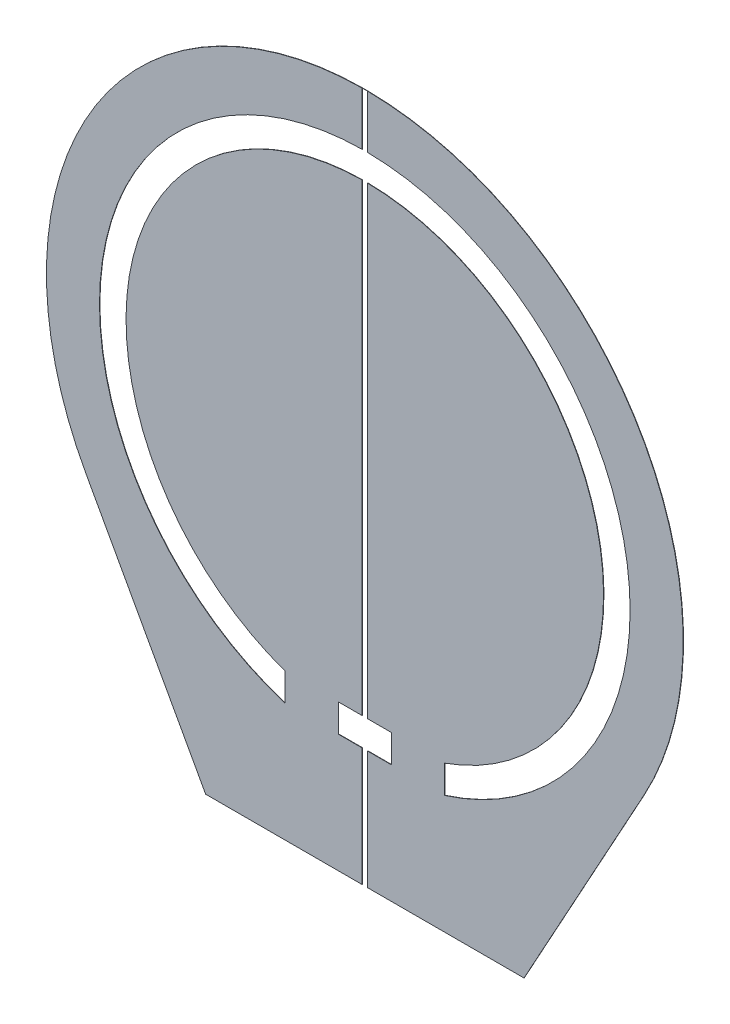
ISO-10303-21;
HEADER;
FILE_DESCRIPTION(('STEP AP214'),'2;1');
FILE_NAME('part.step','',(''),(''),'','','');
FILE_SCHEMA(('AUTOMOTIVE_DESIGN { 1 0 10303 214 1 1 1 1 }'));
ENDSEC;
DATA;
#1=APPLICATION_CONTEXT('core data for automotive mechanical design processes');
#2=APPLICATION_PROTOCOL_DEFINITION('international standard','automotive_design',2000,#1);
#3=PRODUCT_CONTEXT('',#1,'mechanical');
#4=PRODUCT('Part','Part','',(#3));
#5=PRODUCT_RELATED_PRODUCT_CATEGORY('part','',(#4));
#6=PRODUCT_DEFINITION_FORMATION('','',#4);
#7=PRODUCT_DEFINITION_CONTEXT('part definition',#1,'design');
#8=PRODUCT_DEFINITION('design','',#6,#7);
#9=PRODUCT_DEFINITION_SHAPE('','',#8);
#10=(LENGTH_UNIT() NAMED_UNIT(*) SI_UNIT(.MILLI.,.METRE.));
#11=(NAMED_UNIT(*) PLANE_ANGLE_UNIT() SI_UNIT($,.RADIAN.));
#12=(NAMED_UNIT(*) SI_UNIT($,.STERADIAN.) SOLID_ANGLE_UNIT());
#13=UNCERTAINTY_MEASURE_WITH_UNIT(LENGTH_MEASURE(1.E-05),#10,'distance_accuracy_value','');
#14=(GEOMETRIC_REPRESENTATION_CONTEXT(3) GLOBAL_UNCERTAINTY_ASSIGNED_CONTEXT((#13)) GLOBAL_UNIT_ASSIGNED_CONTEXT((#10,
#11,#12)) REPRESENTATION_CONTEXT('',''));
#15=CARTESIAN_POINT('',(0.,0.,0.));
#16=DIRECTION('',(0.,0.,1.));
#17=DIRECTION('',(1.,0.,0.));
#18=AXIS2_PLACEMENT_3D('',#15,#16,#17);
#19=CARTESIAN_POINT('',(0.,0.,0.03556));
#20=DIRECTION('',(0.,0.,-1.));
#21=DIRECTION('',(-1.,0.,0.));
#22=AXIS2_PLACEMENT_3D('',#19,#20,#21);
#23=CYLINDRICAL_SURFACE('',#22,30.);
#24=CARTESIAN_POINT('',(0.,0.,0.03556));
#25=DIRECTION('',(0.,0.,1.));
#26=DIRECTION('',(1.,0.,0.));
#27=AXIS2_PLACEMENT_3D('',#24,#25,#26);
#28=CIRCLE('',#27,30.);
#29=CARTESIAN_POINT('',(-0.25,29.9989583152482,0.03556));
#30=VERTEX_POINT('',#29);
#31=CARTESIAN_POINT('',(-26.2928846581436,-14.4459065604605,0.03556));
#32=VERTEX_POINT('',#31);
#33=EDGE_CURVE('E171',#30,#32,#28,.T.);
#34=ORIENTED_EDGE('',*,*,#33,.F.);
#35=DIRECTION('',(0.,0.,1.));
#36=VECTOR('',#35,1.);
#37=CARTESIAN_POINT('',(-0.25,29.9989583152482,-0.96444));
#38=LINE('',#37,#36);
#39=CARTESIAN_POINT('',(-0.25,29.9989583152482,0.));
#40=VERTEX_POINT('',#39);
#41=EDGE_CURVE('E12',#40,#30,#38,.T.);
#42=ORIENTED_EDGE('',*,*,#41,.F.);
#43=CARTESIAN_POINT('',(0.,0.,0.));
#44=DIRECTION('',(0.,0.,1.));
#45=DIRECTION('',(1.,0.,0.));
#46=AXIS2_PLACEMENT_3D('',#43,#44,#45);
#47=CIRCLE('',#46,30.);
#48=CARTESIAN_POINT('',(-26.2928846581436,-14.4459065604605,0.));
#49=VERTEX_POINT('',#48);
#50=EDGE_CURVE('E184',#40,#49,#47,.T.);
#51=ORIENTED_EDGE('',*,*,#50,.T.);
#52=DIRECTION('',(0.,0.,-1.));
#53=VECTOR('',#52,1.);
#54=CARTESIAN_POINT('',(-26.2928846581436,-14.4459065604605,0.03556));
#55=LINE('',#54,#53);
#56=EDGE_CURVE('E180',#32,#49,#55,.T.);
#57=ORIENTED_EDGE('',*,*,#56,.F.);
#58=EDGE_LOOP('',(#34,#42,#51,#57));
#59=FACE_BOUND('',#58,.T.);
#60=ADVANCED_FACE('F53',(#59),#23,.T.);
#61=CARTESIAN_POINT('',(0.,0.,0.03556));
#62=DIRECTION('',(0.,0.,-1.));
#63=DIRECTION('',(-1.,0.,0.));
#64=AXIS2_PLACEMENT_3D('',#61,#62,#63);
#65=CYLINDRICAL_SURFACE('',#64,25.);
#66=CARTESIAN_POINT('',(0.,0.,0.));
#67=DIRECTION('',(0.,0.,1.));
#68=DIRECTION('',(1.,0.,0.));
#69=AXIS2_PLACEMENT_3D('',#66,#67,#68);
#70=CIRCLE('',#69,25.);
#71=CARTESIAN_POINT('',(-0.25,24.9987499687484,0.));
#72=VERTEX_POINT('',#71);
#73=CARTESIAN_POINT('',(-7.5,-23.8484800354236,0.));
#74=VERTEX_POINT('',#73);
#75=EDGE_CURVE('E56',#72,#74,#70,.T.);
#76=ORIENTED_EDGE('',*,*,#75,.F.);
#77=DIRECTION('',(0.,0.,-1.));
#78=VECTOR('',#77,1.);
#79=CARTESIAN_POINT('',(-0.25,24.9987499687484,0.03556));
#80=LINE('',#79,#78);
#81=CARTESIAN_POINT('',(-0.25,24.9987499687484,0.03556));
#82=VERTEX_POINT('',#81);
#83=EDGE_CURVE('E71',#72,#82,#80,.F.);
#84=ORIENTED_EDGE('',*,*,#83,.T.);
#85=CARTESIAN_POINT('',(0.,0.,0.03556));
#86=DIRECTION('',(0.,0.,1.));
#87=DIRECTION('',(1.,0.,0.));
#88=AXIS2_PLACEMENT_3D('',#85,#86,#87);
#89=CIRCLE('',#88,25.);
#90=CARTESIAN_POINT('',(-7.5,-23.8484800354236,0.03556));
#91=VERTEX_POINT('',#90);
#92=EDGE_CURVE('E181',#82,#91,#89,.T.);
#93=ORIENTED_EDGE('',*,*,#92,.T.);
#94=DIRECTION('',(0.,0.,-1.));
#95=VECTOR('',#94,1.);
#96=CARTESIAN_POINT('',(-7.5,-23.8484800354236,0.03556));
#97=LINE('',#96,#95);
#98=EDGE_CURVE('E183',#91,#74,#97,.T.);
#99=ORIENTED_EDGE('',*,*,#98,.T.);
#100=EDGE_LOOP('',(#76,#84,#93,#99));
#101=FACE_BOUND('',#100,.T.);
#102=ADVANCED_FACE('F244',(#101),#65,.F.);
#103=CARTESIAN_POINT('',(0.,0.,0.03556));
#104=DIRECTION('',(0.,0.,1.));
#105=DIRECTION('',(1.,0.,0.));
#106=AXIS2_PLACEMENT_3D('',#103,#104,#105);
#107=PLANE('',#106);
#108=ORIENTED_EDGE('',*,*,#92,.F.);
#109=DIRECTION('',(0.,1.,0.));
#110=VECTOR('',#109,1.);
#111=CARTESIAN_POINT('',(-0.25,22.4986110682415,0.03556));
#112=LINE('',#111,#110);
#113=EDGE_CURVE('E174',#82,#30,#112,.T.);
#114=ORIENTED_EDGE('',*,*,#113,.T.);
#115=ORIENTED_EDGE('',*,*,#33,.T.);
#116=DIRECTION('',(-0.481530218682018,0.876429488604787,0.));
#117=VECTOR('',#116,1.);
#118=CARTESIAN_POINT('',(-26.2928846581436,-14.4459065604605,0.03556));
#119=LINE('',#118,#117);
#120=CARTESIAN_POINT('',(-15.,-35.0000000354236,0.03556));
#121=VERTEX_POINT('',#120);
#122=EDGE_CURVE('E166',#121,#32,#119,.T.);
#123=ORIENTED_EDGE('',*,*,#122,.F.);
#124=DIRECTION('',(-1.,0.,0.));
#125=VECTOR('',#124,1.);
#126=CARTESIAN_POINT('',(0.,-35.0000000354236,0.03556));
#127=LINE('',#126,#125);
#128=CARTESIAN_POINT('',(-0.25,-35.0000000354236,0.03556));
#129=VERTEX_POINT('',#128);
#130=EDGE_CURVE('E148',#129,#121,#127,.T.);
#131=ORIENTED_EDGE('',*,*,#130,.F.);
#132=DIRECTION('',(0.,-1.,0.));
#133=VECTOR('',#132,1.);
#134=CARTESIAN_POINT('',(-0.25,-21.2132034355964,0.03556));
#135=LINE('',#134,#133);
#136=CARTESIAN_POINT('',(-0.25,-23.8484800355964,0.03556));
#137=VERTEX_POINT('',#136);
#138=EDGE_CURVE('E139',#137,#129,#135,.T.);
#139=ORIENTED_EDGE('',*,*,#138,.F.);
#140=DIRECTION('',(1.,0.,0.));
#141=VECTOR('',#140,1.);
#142=CARTESIAN_POINT('',(0.,-23.8484800355964,0.03556));
#143=LINE('',#142,#141);
#144=CARTESIAN_POINT('',(-2.5,-23.8484800355964,0.03556));
#145=VERTEX_POINT('',#144);
#146=EDGE_CURVE('E176',#145,#137,#143,.T.);
#147=ORIENTED_EDGE('',*,*,#146,.F.);
#148=DIRECTION('',(0.,-1.,0.));
#149=VECTOR('',#148,1.);
#150=CARTESIAN_POINT('',(-2.50000000000001,0.,0.03556));
#151=LINE('',#150,#149);
#152=CARTESIAN_POINT('',(-2.5,-21.2132034355964,0.03556));
#153=VERTEX_POINT('',#152);
#154=EDGE_CURVE('E179',#153,#145,#151,.T.);
#155=ORIENTED_EDGE('',*,*,#154,.F.);
#156=DIRECTION('',(1.,0.,0.));
#157=VECTOR('',#156,1.);
#158=CARTESIAN_POINT('',(0.,-21.2132034355964,0.03556));
#159=LINE('',#158,#157);
#160=CARTESIAN_POINT('',(-0.25,-21.2132034355964,0.03556));
#161=VERTEX_POINT('',#160);
#162=EDGE_CURVE('E173',#153,#161,#159,.T.);
#163=ORIENTED_EDGE('',*,*,#162,.T.);
#164=DIRECTION('',(0.,1.,0.));
#165=VECTOR('',#164,1.);
#166=CARTESIAN_POINT('',(-0.25,0.,0.03556));
#167=LINE('',#166,#165);
#168=CARTESIAN_POINT('',(-0.25,22.4986110682415,0.03556));
#169=VERTEX_POINT('',#168);
#170=EDGE_CURVE('E195',#161,#169,#167,.T.);
#171=ORIENTED_EDGE('',*,*,#170,.T.);
#172=CARTESIAN_POINT('',(0.,0.,0.03556));
#173=DIRECTION('',(0.,0.,1.));
#174=DIRECTION('',(1.,0.,0.));
#175=AXIS2_PLACEMENT_3D('',#172,#173,#174);
#176=CIRCLE('',#175,22.5);
#177=CARTESIAN_POINT('',(-7.5,-21.2132034355964,0.03556));
#178=VERTEX_POINT('',#177);
#179=EDGE_CURVE('E197',#169,#178,#176,.T.);
#180=ORIENTED_EDGE('',*,*,#179,.T.);
#181=DIRECTION('',(0.,-1.,0.));
#182=VECTOR('',#181,1.);
#183=CARTESIAN_POINT('',(-7.49999999999999,0.,0.03556));
#184=LINE('',#183,#182);
#185=EDGE_CURVE('E199',#178,#91,#184,.T.);
#186=ORIENTED_EDGE('',*,*,#185,.T.);
#187=EDGE_LOOP('',(#108,#114,#115,#123,#131,#139,#147,#155,#163,#171,#180,#186));
#188=FACE_BOUND('',#187,.T.);
#189=ADVANCED_FACE('F242',(#188),#107,.T.);
#190=CARTESIAN_POINT('',(0.,0.,0.));
#191=DIRECTION('',(0.,0.,1.));
#192=DIRECTION('',(1.,0.,0.));
#193=AXIS2_PLACEMENT_3D('',#190,#191,#192);
#194=PLANE('',#193);
#195=DIRECTION('',(0.,1.,0.));
#196=VECTOR('',#195,1.);
#197=CARTESIAN_POINT('',(-0.25,0.,0.));
#198=LINE('',#197,#196);
#199=EDGE_CURVE('E62',#72,#40,#198,.T.);
#200=ORIENTED_EDGE('',*,*,#199,.F.);
#201=ORIENTED_EDGE('',*,*,#75,.T.);
#202=DIRECTION('',(0.,-1.,0.));
#203=VECTOR('',#202,1.);
#204=CARTESIAN_POINT('',(-7.49999999999999,0.,0.));
#205=LINE('',#204,#203);
#206=CARTESIAN_POINT('',(-7.5,-21.2132034355964,0.));
#207=VERTEX_POINT('',#206);
#208=EDGE_CURVE('E214',#207,#74,#205,.T.);
#209=ORIENTED_EDGE('',*,*,#208,.F.);
#210=CARTESIAN_POINT('',(0.,0.,0.));
#211=DIRECTION('',(0.,0.,1.));
#212=DIRECTION('',(1.,0.,0.));
#213=AXIS2_PLACEMENT_3D('',#210,#211,#212);
#214=CIRCLE('',#213,22.5);
#215=CARTESIAN_POINT('',(-0.25,22.4986110682415,0.));
#216=VERTEX_POINT('',#215);
#217=EDGE_CURVE('E211',#216,#207,#214,.T.);
#218=ORIENTED_EDGE('',*,*,#217,.F.);
#219=DIRECTION('',(0.,1.,0.));
#220=VECTOR('',#219,1.);
#221=CARTESIAN_POINT('',(-0.25,0.,0.));
#222=LINE('',#221,#220);
#223=CARTESIAN_POINT('',(-0.25,-21.2132034355964,0.));
#224=VERTEX_POINT('',#223);
#225=EDGE_CURVE('E208',#224,#216,#222,.T.);
#226=ORIENTED_EDGE('',*,*,#225,.F.);
#227=DIRECTION('',(1.,0.,0.));
#228=VECTOR('',#227,1.);
#229=CARTESIAN_POINT('',(0.,-21.2132034355964,0.));
#230=LINE('',#229,#228);
#231=CARTESIAN_POINT('',(-2.5,-21.2132034355964,0.));
#232=VERTEX_POINT('',#231);
#233=EDGE_CURVE('E205',#232,#224,#230,.T.);
#234=ORIENTED_EDGE('',*,*,#233,.F.);
#235=DIRECTION('',(0.,-1.,0.));
#236=VECTOR('',#235,1.);
#237=CARTESIAN_POINT('',(-2.50000000000001,0.,0.));
#238=LINE('',#237,#236);
#239=CARTESIAN_POINT('',(-2.5,-23.8484800355964,0.));
#240=VERTEX_POINT('',#239);
#241=EDGE_CURVE('E170',#232,#240,#238,.T.);
#242=ORIENTED_EDGE('',*,*,#241,.T.);
#243=DIRECTION('',(1.,0.,0.));
#244=VECTOR('',#243,1.);
#245=CARTESIAN_POINT('',(0.,-23.8484800355964,0.));
#246=LINE('',#245,#244);
#247=CARTESIAN_POINT('',(-0.25,-23.8484800355964,0.));
#248=VERTEX_POINT('',#247);
#249=EDGE_CURVE('E159',#240,#248,#246,.T.);
#250=ORIENTED_EDGE('',*,*,#249,.T.);
#251=DIRECTION('',(0.,-1.,0.));
#252=VECTOR('',#251,1.);
#253=CARTESIAN_POINT('',(-0.249999999999999,0.,0.));
#254=LINE('',#253,#252);
#255=CARTESIAN_POINT('',(-0.25,-35.0000000354236,0.));
#256=VERTEX_POINT('',#255);
#257=EDGE_CURVE('E144',#248,#256,#254,.T.);
#258=ORIENTED_EDGE('',*,*,#257,.T.);
#259=DIRECTION('',(-1.,0.,0.));
#260=VECTOR('',#259,1.);
#261=CARTESIAN_POINT('',(0.,-35.0000000354236,0.));
#262=LINE('',#261,#260);
#263=CARTESIAN_POINT('',(-15.,-35.0000000354236,0.));
#264=VERTEX_POINT('',#263);
#265=EDGE_CURVE('E155',#256,#264,#262,.T.);
#266=ORIENTED_EDGE('',*,*,#265,.T.);
#267=DIRECTION('',(-0.481530218682018,0.876429488604787,0.));
#268=VECTOR('',#267,1.);
#269=CARTESIAN_POINT('',(-26.2928846581436,-14.4459065604605,0.));
#270=LINE('',#269,#268);
#271=EDGE_CURVE('E165',#264,#49,#270,.T.);
#272=ORIENTED_EDGE('',*,*,#271,.T.);
#273=ORIENTED_EDGE('',*,*,#50,.F.);
#274=EDGE_LOOP('',(#200,#201,#209,#218,#226,#234,#242,#250,#258,#266,#272,#273));
#275=FACE_BOUND('',#274,.T.);
#276=ADVANCED_FACE('F153',(#275),#194,.F.);
#277=CARTESIAN_POINT('',(-26.2928846581436,-14.4459065604605,0.03556));
#278=DIRECTION('',(-0.876429488604787,-0.481530218682018,0.));
#279=DIRECTION('',(0.481530218682018,-0.876429488604787,0.));
#280=AXIS2_PLACEMENT_3D('',#277,#278,#279);
#281=PLANE('',#280);
#282=ORIENTED_EDGE('',*,*,#271,.F.);
#283=DIRECTION('',(0.,0.,-1.));
#284=VECTOR('',#283,1.);
#285=CARTESIAN_POINT('',(-15.,-35.0000000354236,0.03556));
#286=LINE('',#285,#284);
#287=EDGE_CURVE('E163',#121,#264,#286,.T.);
#288=ORIENTED_EDGE('',*,*,#287,.F.);
#289=ORIENTED_EDGE('',*,*,#122,.T.);
#290=ORIENTED_EDGE('',*,*,#56,.T.);
#291=EDGE_LOOP('',(#282,#288,#289,#290));
#292=FACE_BOUND('',#291,.T.);
#293=ADVANCED_FACE('F238',(#292),#281,.T.);
#294=CARTESIAN_POINT('',(0.,-23.8484800355964,0.03556));
#295=DIRECTION('',(0.,1.,0.));
#296=DIRECTION('',(0.,0.,1.));
#297=AXIS2_PLACEMENT_3D('',#294,#295,#296);
#298=PLANE('',#297);
#299=DIRECTION('',(0.,0.,1.));
#300=VECTOR('',#299,1.);
#301=CARTESIAN_POINT('',(-0.25,-23.8484800355964,0.03556));
#302=LINE('',#301,#300);
#303=EDGE_CURVE('E136',#248,#137,#302,.T.);
#304=ORIENTED_EDGE('',*,*,#303,.F.);
#305=ORIENTED_EDGE('',*,*,#249,.F.);
#306=DIRECTION('',(0.,0.,-1.));
#307=VECTOR('',#306,1.);
#308=CARTESIAN_POINT('',(-2.5,-23.8484800355964,0.03556));
#309=LINE('',#308,#307);
#310=EDGE_CURVE('E193',#145,#240,#309,.T.);
#311=ORIENTED_EDGE('',*,*,#310,.F.);
#312=ORIENTED_EDGE('',*,*,#146,.T.);
#313=EDGE_LOOP('',(#304,#305,#311,#312));
#314=FACE_BOUND('',#313,.T.);
#315=ADVANCED_FACE('F270',(#314),#298,.T.);
#316=CARTESIAN_POINT('',(-2.50000000000001,0.,0.03556));
#317=DIRECTION('',(1.,0.,0.));
#318=DIRECTION('',(0.,1.,0.));
#319=AXIS2_PLACEMENT_3D('',#316,#317,#318);
#320=PLANE('',#319);
#321=ORIENTED_EDGE('',*,*,#241,.F.);
#322=DIRECTION('',(0.,0.,-1.));
#323=VECTOR('',#322,1.);
#324=CARTESIAN_POINT('',(-2.5,-21.2132034355964,0.03556));
#325=LINE('',#324,#323);
#326=EDGE_CURVE('E207',#153,#232,#325,.T.);
#327=ORIENTED_EDGE('',*,*,#326,.F.);
#328=ORIENTED_EDGE('',*,*,#154,.T.);
#329=ORIENTED_EDGE('',*,*,#310,.T.);
#330=EDGE_LOOP('',(#321,#327,#328,#329));
#331=FACE_BOUND('',#330,.T.);
#332=ADVANCED_FACE('F265',(#331),#320,.T.);
#333=CARTESIAN_POINT('',(0.,-21.2132034355964,0.03556));
#334=DIRECTION('',(0.,1.,0.));
#335=DIRECTION('',(-1.,0.,0.));
#336=AXIS2_PLACEMENT_3D('',#333,#334,#335);
#337=PLANE('',#336);
#338=ORIENTED_EDGE('',*,*,#233,.T.);
#339=DIRECTION('',(0.,0.,-1.));
#340=VECTOR('',#339,1.);
#341=CARTESIAN_POINT('',(-0.25,-21.2132034355964,0.03556));
#342=LINE('',#341,#340);
#343=EDGE_CURVE('E210',#161,#224,#342,.T.);
#344=ORIENTED_EDGE('',*,*,#343,.F.);
#345=ORIENTED_EDGE('',*,*,#162,.F.);
#346=ORIENTED_EDGE('',*,*,#326,.T.);
#347=EDGE_LOOP('',(#338,#344,#345,#346));
#348=FACE_BOUND('',#347,.T.);
#349=ADVANCED_FACE('F271',(#348),#337,.F.);
#350=CARTESIAN_POINT('',(-0.25,0.,0.03556));
#351=DIRECTION('',(-1.,0.,0.));
#352=DIRECTION('',(0.,0.,1.));
#353=AXIS2_PLACEMENT_3D('',#350,#351,#352);
#354=PLANE('',#353);
#355=ORIENTED_EDGE('',*,*,#225,.T.);
#356=DIRECTION('',(0.,0.,-1.));
#357=VECTOR('',#356,1.);
#358=CARTESIAN_POINT('',(-0.25,22.4986110682415,0.03556));
#359=LINE('',#358,#357);
#360=EDGE_CURVE('E213',#169,#216,#359,.T.);
#361=ORIENTED_EDGE('',*,*,#360,.F.);
#362=ORIENTED_EDGE('',*,*,#170,.F.);
#363=ORIENTED_EDGE('',*,*,#343,.T.);
#364=EDGE_LOOP('',(#355,#361,#362,#363));
#365=FACE_BOUND('',#364,.T.);
#366=ADVANCED_FACE('F259',(#365),#354,.F.);
#367=CARTESIAN_POINT('',(0.,0.,0.03556));
#368=DIRECTION('',(0.,0.,-1.));
#369=DIRECTION('',(-1.,0.,0.));
#370=AXIS2_PLACEMENT_3D('',#367,#368,#369);
#371=CYLINDRICAL_SURFACE('',#370,22.5);
#372=ORIENTED_EDGE('',*,*,#217,.T.);
#373=DIRECTION('',(0.,0.,-1.));
#374=VECTOR('',#373,1.);
#375=CARTESIAN_POINT('',(-7.5,-21.2132034355964,0.03556));
#376=LINE('',#375,#374);
#377=EDGE_CURVE('E149',#178,#207,#376,.T.);
#378=ORIENTED_EDGE('',*,*,#377,.F.);
#379=ORIENTED_EDGE('',*,*,#179,.F.);
#380=ORIENTED_EDGE('',*,*,#360,.T.);
#381=EDGE_LOOP('',(#372,#378,#379,#380));
#382=FACE_BOUND('',#381,.T.);
#383=ADVANCED_FACE('F255',(#382),#371,.T.);
#384=CARTESIAN_POINT('',(-7.49999999999999,0.,0.03556));
#385=DIRECTION('',(1.,0.,0.));
#386=DIRECTION('',(0.,1.,0.));
#387=AXIS2_PLACEMENT_3D('',#384,#385,#386);
#388=PLANE('',#387);
#389=ORIENTED_EDGE('',*,*,#208,.T.);
#390=ORIENTED_EDGE('',*,*,#98,.F.);
#391=ORIENTED_EDGE('',*,*,#185,.F.);
#392=ORIENTED_EDGE('',*,*,#377,.T.);
#393=EDGE_LOOP('',(#389,#390,#391,#392));
#394=FACE_BOUND('',#393,.T.);
#395=ADVANCED_FACE('F250',(#394),#388,.F.);
#396=CARTESIAN_POINT('',(0.,-35.0000000354236,0.03556));
#397=DIRECTION('',(0.,-1.,0.));
#398=DIRECTION('',(1.,0.,0.));
#399=AXIS2_PLACEMENT_3D('',#396,#397,#398);
#400=PLANE('',#399);
#401=DIRECTION('',(0.,0.,1.));
#402=VECTOR('',#401,1.);
#403=CARTESIAN_POINT('',(-0.25,-35.0000000354236,-0.96444));
#404=LINE('',#403,#402);
#405=EDGE_CURVE('E141',#256,#129,#404,.T.);
#406=ORIENTED_EDGE('',*,*,#405,.T.);
#407=ORIENTED_EDGE('',*,*,#130,.T.);
#408=ORIENTED_EDGE('',*,*,#287,.T.);
#409=ORIENTED_EDGE('',*,*,#265,.F.);
#410=EDGE_LOOP('',(#406,#407,#408,#409));
#411=FACE_BOUND('',#410,.T.);
#412=ADVANCED_FACE('F161',(#411),#400,.T.);
#413=CARTESIAN_POINT('',(-0.25,-21.2132034355964,-0.96444));
#414=DIRECTION('',(-1.,0.,0.));
#415=DIRECTION('',(0.,-1.,0.));
#416=AXIS2_PLACEMENT_3D('',#413,#414,#415);
#417=PLANE('',#416);
#418=ORIENTED_EDGE('',*,*,#303,.T.);
#419=ORIENTED_EDGE('',*,*,#138,.T.);
#420=ORIENTED_EDGE('',*,*,#405,.F.);
#421=ORIENTED_EDGE('',*,*,#257,.F.);
#422=EDGE_LOOP('',(#418,#419,#420,#421));
#423=FACE_BOUND('',#422,.T.);
#424=ADVANCED_FACE('F143',(#423),#417,.F.);
#425=CARTESIAN_POINT('',(-0.25,22.4986110682415,-0.96444));
#426=DIRECTION('',(1.,0.,0.));
#427=DIRECTION('',(0.,0.,-1.));
#428=AXIS2_PLACEMENT_3D('',#425,#426,#427);
#429=PLANE('',#428);
#430=ORIENTED_EDGE('',*,*,#199,.T.);
#431=ORIENTED_EDGE('',*,*,#41,.T.);
#432=ORIENTED_EDGE('',*,*,#113,.F.);
#433=ORIENTED_EDGE('',*,*,#83,.F.);
#434=EDGE_LOOP('',(#430,#431,#432,#433));
#435=FACE_BOUND('',#434,.T.);
#436=ADVANCED_FACE('F231',(#435),#429,.T.);
#437=CLOSED_SHELL('',(#60,#102,#189,#276,#293,#315,#332,#349,#366,#383,#395,#412,#424,#436));
#438=MANIFOLD_SOLID_BREP('B2',#437);
#439=CARTESIAN_POINT('',(7.50000000000002,0.,0.03556));
#440=DIRECTION('',(1.,0.,0.));
#441=DIRECTION('',(0.,1.,0.));
#442=AXIS2_PLACEMENT_3D('',#439,#440,#441);
#443=PLANE('',#442);
#444=DIRECTION('',(0.,-1.,0.));
#445=VECTOR('',#444,1.);
#446=CARTESIAN_POINT('',(7.50000000000002,0.,0.));
#447=LINE('',#446,#445);
#448=CARTESIAN_POINT('',(7.5,-21.2132034355964,0.));
#449=VERTEX_POINT('',#448);
#450=CARTESIAN_POINT('',(7.5,-23.8484800354236,0.));
#451=VERTEX_POINT('',#450);
#452=EDGE_CURVE('E496',#449,#451,#447,.T.);
#453=ORIENTED_EDGE('',*,*,#452,.F.);
#454=DIRECTION('',(0.,0.,-1.));
#455=VECTOR('',#454,1.);
#456=CARTESIAN_POINT('',(7.5,-21.2132034355964,0.03556));
#457=LINE('',#456,#455);
#458=CARTESIAN_POINT('',(7.5,-21.2132034355964,0.03556));
#459=VERTEX_POINT('',#458);
#460=EDGE_CURVE('E493',#459,#449,#457,.T.);
#461=ORIENTED_EDGE('',*,*,#460,.F.);
#462=DIRECTION('',(0.,-1.,0.));
#463=VECTOR('',#462,1.);
#464=CARTESIAN_POINT('',(7.50000000000002,0.,0.03556));
#465=LINE('',#464,#463);
#466=CARTESIAN_POINT('',(7.5,-23.8484800354236,0.03556));
#467=VERTEX_POINT('',#466);
#468=EDGE_CURVE('E497',#459,#467,#465,.T.);
#469=ORIENTED_EDGE('',*,*,#468,.T.);
#470=DIRECTION('',(0.,0.,-1.));
#471=VECTOR('',#470,1.);
#472=CARTESIAN_POINT('',(7.5,-23.8484800354236,0.03556));
#473=LINE('',#472,#471);
#474=EDGE_CURVE('E500',#467,#451,#473,.T.);
#475=ORIENTED_EDGE('',*,*,#474,.T.);
#476=EDGE_LOOP('',(#453,#461,#469,#475));
#477=FACE_BOUND('',#476,.T.);
#478=ADVANCED_FACE('F402',(#477),#443,.T.);
#479=CARTESIAN_POINT('',(0.,0.,0.03556));
#480=DIRECTION('',(0.,0.,-1.));
#481=DIRECTION('',(-1.,0.,0.));
#482=AXIS2_PLACEMENT_3D('',#479,#480,#481);
#483=CYLINDRICAL_SURFACE('',#482,22.5);
#484=CARTESIAN_POINT('',(0.,0.,0.));
#485=DIRECTION('',(0.,0.,1.));
#486=DIRECTION('',(1.,0.,0.));
#487=AXIS2_PLACEMENT_3D('',#484,#485,#486);
#488=CIRCLE('',#487,22.5);
#489=CARTESIAN_POINT('',(0.25,22.4986110682415,0.));
#490=VERTEX_POINT('',#489);
#491=EDGE_CURVE('E539',#449,#490,#488,.T.);
#492=ORIENTED_EDGE('',*,*,#491,.T.);
#493=DIRECTION('',(0.,0.,-1.));
#494=VECTOR('',#493,1.);
#495=CARTESIAN_POINT('',(0.25,22.4986110682415,0.03556));
#496=LINE('',#495,#494);
#497=CARTESIAN_POINT('',(0.25,22.4986110682415,0.03556));
#498=VERTEX_POINT('',#497);
#499=EDGE_CURVE('E492',#498,#490,#496,.T.);
#500=ORIENTED_EDGE('',*,*,#499,.F.);
#501=CARTESIAN_POINT('',(0.,0.,0.03556));
#502=DIRECTION('',(0.,0.,1.));
#503=DIRECTION('',(1.,0.,0.));
#504=AXIS2_PLACEMENT_3D('',#501,#502,#503);
#505=CIRCLE('',#504,22.5);
#506=EDGE_CURVE('E488',#459,#498,#505,.T.);
#507=ORIENTED_EDGE('',*,*,#506,.F.);
#508=ORIENTED_EDGE('',*,*,#460,.T.);
#509=EDGE_LOOP('',(#492,#500,#507,#508));
#510=FACE_BOUND('',#509,.T.);
#511=ADVANCED_FACE('F606',(#510),#483,.T.);
#512=CARTESIAN_POINT('',(0.25,0.,0.03556));
#513=DIRECTION('',(-1.,0.,0.));
#514=DIRECTION('',(0.,0.,1.));
#515=AXIS2_PLACEMENT_3D('',#512,#513,#514);
#516=PLANE('',#515);
#517=DIRECTION('',(0.,1.,0.));
#518=VECTOR('',#517,1.);
#519=CARTESIAN_POINT('',(0.25,0.,0.));
#520=LINE('',#519,#518);
#521=CARTESIAN_POINT('',(0.25,-21.2132034355964,0.));
#522=VERTEX_POINT('',#521);
#523=EDGE_CURVE('E536',#522,#490,#520,.T.);
#524=ORIENTED_EDGE('',*,*,#523,.F.);
#525=DIRECTION('',(0.,0.,-1.));
#526=VECTOR('',#525,1.);
#527=CARTESIAN_POINT('',(0.25,-21.2132034355964,0.03556));
#528=LINE('',#527,#526);
#529=CARTESIAN_POINT('',(0.25,-21.2132034355964,0.03556));
#530=VERTEX_POINT('',#529);
#531=EDGE_CURVE('E532',#530,#522,#528,.T.);
#532=ORIENTED_EDGE('',*,*,#531,.F.);
#533=DIRECTION('',(0.,1.,0.));
#534=VECTOR('',#533,1.);
#535=CARTESIAN_POINT('',(0.25,0.,0.03556));
#536=LINE('',#535,#534);
#537=EDGE_CURVE('E489',#530,#498,#536,.T.);
#538=ORIENTED_EDGE('',*,*,#537,.T.);
#539=ORIENTED_EDGE('',*,*,#499,.T.);
#540=EDGE_LOOP('',(#524,#532,#538,#539));
#541=FACE_BOUND('',#540,.T.);
#542=ADVANCED_FACE('F611',(#541),#516,.T.);
#543=CARTESIAN_POINT('',(0.,-21.2132034355964,0.03556));
#544=DIRECTION('',(0.,1.,0.));
#545=DIRECTION('',(-1.,0.,0.));
#546=AXIS2_PLACEMENT_3D('',#543,#544,#545);
#547=PLANE('',#546);
#548=DIRECTION('',(1.,0.,0.));
#549=VECTOR('',#548,1.);
#550=CARTESIAN_POINT('',(0.,-21.2132034355964,0.));
#551=LINE('',#550,#549);
#552=CARTESIAN_POINT('',(2.5,-21.2132034355964,0.));
#553=VERTEX_POINT('',#552);
#554=EDGE_CURVE('E533',#522,#553,#551,.T.);
#555=ORIENTED_EDGE('',*,*,#554,.T.);
#556=DIRECTION('',(0.,0.,-1.));
#557=VECTOR('',#556,1.);
#558=CARTESIAN_POINT('',(2.5,-21.2132034355964,0.03556));
#559=LINE('',#558,#557);
#560=CARTESIAN_POINT('',(2.5,-21.2132034355964,0.03556));
#561=VERTEX_POINT('',#560);
#562=EDGE_CURVE('E519',#561,#553,#559,.T.);
#563=ORIENTED_EDGE('',*,*,#562,.F.);
#564=DIRECTION('',(1.,0.,0.));
#565=VECTOR('',#564,1.);
#566=CARTESIAN_POINT('',(0.,-21.2132034355964,0.03556));
#567=LINE('',#566,#565);
#568=EDGE_CURVE('E485',#530,#561,#567,.T.);
#569=ORIENTED_EDGE('',*,*,#568,.F.);
#570=ORIENTED_EDGE('',*,*,#531,.T.);
#571=EDGE_LOOP('',(#555,#563,#569,#570));
#572=FACE_BOUND('',#571,.T.);
#573=ADVANCED_FACE('F616',(#572),#547,.F.);
#574=CARTESIAN_POINT('',(2.5,0.,0.03556));
#575=DIRECTION('',(1.,0.,0.));
#576=DIRECTION('',(0.,1.,0.));
#577=AXIS2_PLACEMENT_3D('',#574,#575,#576);
#578=PLANE('',#577);
#579=DIRECTION('',(0.,-1.,0.));
#580=VECTOR('',#579,1.);
#581=CARTESIAN_POINT('',(2.5,0.,0.));
#582=LINE('',#581,#580);
#583=CARTESIAN_POINT('',(2.5,-23.8484800355964,0.));
#584=VERTEX_POINT('',#583);
#585=EDGE_CURVE('E530',#553,#584,#582,.T.);
#586=ORIENTED_EDGE('',*,*,#585,.T.);
#587=DIRECTION('',(0.,0.,-1.));
#588=VECTOR('',#587,1.);
#589=CARTESIAN_POINT('',(2.5,-23.8484800355964,0.03556));
#590=LINE('',#589,#588);
#591=CARTESIAN_POINT('',(2.5,-23.8484800355964,0.03556));
#592=VERTEX_POINT('',#591);
#593=EDGE_CURVE('E505',#592,#584,#590,.T.);
#594=ORIENTED_EDGE('',*,*,#593,.F.);
#595=DIRECTION('',(0.,-1.,0.));
#596=VECTOR('',#595,1.);
#597=CARTESIAN_POINT('',(2.5,0.,0.03556));
#598=LINE('',#597,#596);
#599=EDGE_CURVE('E466',#561,#592,#598,.T.);
#600=ORIENTED_EDGE('',*,*,#599,.F.);
#601=ORIENTED_EDGE('',*,*,#562,.T.);
#602=EDGE_LOOP('',(#586,#594,#600,#601));
#603=FACE_BOUND('',#602,.T.);
#604=ADVANCED_FACE('F620',(#603),#578,.F.);
#605=CARTESIAN_POINT('',(26.2928846581436,-14.4459065604605,0.03556));
#606=DIRECTION('',(-0.876429488604786,0.481530218682018,0.));
#607=DIRECTION('',(-0.481530218682018,-0.876429488604786,0.));
#608=AXIS2_PLACEMENT_3D('',#605,#606,#607);
#609=PLANE('',#608);
#610=DIRECTION('',(0.481530218682018,0.876429488604786,0.));
#611=VECTOR('',#610,1.);
#612=CARTESIAN_POINT('',(26.2928846581436,-14.4459065604605,0.));
#613=LINE('',#612,#611);
#614=CARTESIAN_POINT('',(15.,-35.0000000354236,0.));
#615=VERTEX_POINT('',#614);
#616=CARTESIAN_POINT('',(26.2928846581436,-14.4459065604606,0.));
#617=VERTEX_POINT('',#616);
#618=EDGE_CURVE('E525',#615,#617,#613,.T.);
#619=ORIENTED_EDGE('',*,*,#618,.T.);
#620=DIRECTION('',(0.,0.,-1.));
#621=VECTOR('',#620,1.);
#622=CARTESIAN_POINT('',(26.2928846581436,-14.4459065604606,0.03556));
#623=LINE('',#622,#621);
#624=CARTESIAN_POINT('',(26.2928846581436,-14.4459065604606,0.03556));
#625=VERTEX_POINT('',#624);
#626=EDGE_CURVE('E521',#625,#617,#623,.T.);
#627=ORIENTED_EDGE('',*,*,#626,.F.);
#628=DIRECTION('',(0.481530218682018,0.876429488604786,0.));
#629=VECTOR('',#628,1.);
#630=CARTESIAN_POINT('',(26.2928846581436,-14.4459065604605,0.03556));
#631=LINE('',#630,#629);
#632=CARTESIAN_POINT('',(15.,-35.0000000354236,0.03556));
#633=VERTEX_POINT('',#632);
#634=EDGE_CURVE('E465',#633,#625,#631,.T.);
#635=ORIENTED_EDGE('',*,*,#634,.F.);
#636=DIRECTION('',(0.,0.,-1.));
#637=VECTOR('',#636,1.);
#638=CARTESIAN_POINT('',(15.,-35.0000000354236,0.03556));
#639=LINE('',#638,#637);
#640=EDGE_CURVE('E471',#633,#615,#639,.T.);
#641=ORIENTED_EDGE('',*,*,#640,.T.);
#642=EDGE_LOOP('',(#619,#627,#635,#641));
#643=FACE_BOUND('',#642,.T.);
#644=ADVANCED_FACE('F623',(#643),#609,.F.);
#645=CARTESIAN_POINT('',(0.,0.,0.));
#646=DIRECTION('',(0.,0.,1.));
#647=DIRECTION('',(1.,0.,0.));
#648=AXIS2_PLACEMENT_3D('',#645,#646,#647);
#649=PLANE('',#648);
#650=CARTESIAN_POINT('',(0.,0.,0.));
#651=DIRECTION('',(0.,0.,1.));
#652=DIRECTION('',(1.,0.,0.));
#653=AXIS2_PLACEMENT_3D('',#650,#651,#652);
#654=CIRCLE('',#653,25.);
#655=CARTESIAN_POINT('',(0.25,24.9987499687484,0.));
#656=VERTEX_POINT('',#655);
#657=EDGE_CURVE('E481',#451,#656,#654,.T.);
#658=ORIENTED_EDGE('',*,*,#657,.T.);
#659=DIRECTION('',(0.,1.,0.));
#660=VECTOR('',#659,1.);
#661=CARTESIAN_POINT('',(0.25,0.,0.));
#662=LINE('',#661,#660);
#663=CARTESIAN_POINT('',(0.25,29.9989583152482,0.));
#664=VERTEX_POINT('',#663);
#665=EDGE_CURVE('E421',#656,#664,#662,.T.);
#666=ORIENTED_EDGE('',*,*,#665,.T.);
#667=CARTESIAN_POINT('',(0.,0.,0.));
#668=DIRECTION('',(0.,0.,1.));
#669=DIRECTION('',(1.,0.,0.));
#670=AXIS2_PLACEMENT_3D('',#667,#668,#669);
#671=CIRCLE('',#670,30.);
#672=EDGE_CURVE('E504',#617,#664,#671,.T.);
#673=ORIENTED_EDGE('',*,*,#672,.F.);
#674=ORIENTED_EDGE('',*,*,#618,.F.);
#675=DIRECTION('',(-1.,0.,0.));
#676=VECTOR('',#675,1.);
#677=CARTESIAN_POINT('',(0.,-35.0000000354236,0.));
#678=LINE('',#677,#676);
#679=CARTESIAN_POINT('',(0.25,-35.0000000354236,0.));
#680=VERTEX_POINT('',#679);
#681=EDGE_CURVE('E526',#615,#680,#678,.T.);
#682=ORIENTED_EDGE('',*,*,#681,.T.);
#683=DIRECTION('',(0.,-1.,0.));
#684=VECTOR('',#683,1.);
#685=CARTESIAN_POINT('',(0.249999999999999,0.,0.));
#686=LINE('',#685,#684);
#687=CARTESIAN_POINT('',(0.25,-23.8484800355964,0.));
#688=VERTEX_POINT('',#687);
#689=EDGE_CURVE('E448',#688,#680,#686,.T.);
#690=ORIENTED_EDGE('',*,*,#689,.F.);
#691=DIRECTION('',(1.,0.,0.));
#692=VECTOR('',#691,1.);
#693=CARTESIAN_POINT('',(0.,-23.8484800355964,0.));
#694=LINE('',#693,#692);
#695=EDGE_CURVE('E406',#688,#584,#694,.T.);
#696=ORIENTED_EDGE('',*,*,#695,.T.);
#697=ORIENTED_EDGE('',*,*,#585,.F.);
#698=ORIENTED_EDGE('',*,*,#554,.F.);
#699=ORIENTED_EDGE('',*,*,#523,.T.);
#700=ORIENTED_EDGE('',*,*,#491,.F.);
#701=ORIENTED_EDGE('',*,*,#452,.T.);
#702=EDGE_LOOP('',(#658,#666,#673,#674,#682,#690,#696,#697,#698,#699,#700,#701));
#703=FACE_BOUND('',#702,.T.);
#704=ADVANCED_FACE('F547',(#703),#649,.F.);
#705=CARTESIAN_POINT('',(0.,0.,0.03556));
#706=DIRECTION('',(0.,0.,1.));
#707=DIRECTION('',(1.,0.,0.));
#708=AXIS2_PLACEMENT_3D('',#705,#706,#707);
#709=PLANE('',#708);
#710=DIRECTION('',(0.,1.,0.));
#711=VECTOR('',#710,1.);
#712=CARTESIAN_POINT('',(0.25,22.4986110682415,0.03556));
#713=LINE('',#712,#711);
#714=CARTESIAN_POINT('',(0.25,24.9987499687484,0.03556));
#715=VERTEX_POINT('',#714);
#716=CARTESIAN_POINT('',(0.25,29.9989583152482,0.03556));
#717=VERTEX_POINT('',#716);
#718=EDGE_CURVE('E51',#715,#717,#713,.T.);
#719=ORIENTED_EDGE('',*,*,#718,.F.);
#720=CARTESIAN_POINT('',(0.,0.,0.03556));
#721=DIRECTION('',(0.,0.,1.));
#722=DIRECTION('',(1.,0.,0.));
#723=AXIS2_PLACEMENT_3D('',#720,#721,#722);
#724=CIRCLE('',#723,25.);
#725=EDGE_CURVE('E501',#467,#715,#724,.T.);
#726=ORIENTED_EDGE('',*,*,#725,.F.);
#727=ORIENTED_EDGE('',*,*,#468,.F.);
#728=ORIENTED_EDGE('',*,*,#506,.T.);
#729=ORIENTED_EDGE('',*,*,#537,.F.);
#730=ORIENTED_EDGE('',*,*,#568,.T.);
#731=ORIENTED_EDGE('',*,*,#599,.T.);
#732=DIRECTION('',(1.,0.,0.));
#733=VECTOR('',#732,1.);
#734=CARTESIAN_POINT('',(0.,-23.8484800355964,0.03556));
#735=LINE('',#734,#733);
#736=CARTESIAN_POINT('',(0.25,-23.8484800355964,0.03556));
#737=VERTEX_POINT('',#736);
#738=EDGE_CURVE('E464',#737,#592,#735,.T.);
#739=ORIENTED_EDGE('',*,*,#738,.F.);
#740=DIRECTION('',(0.,-1.,0.));
#741=VECTOR('',#740,1.);
#742=CARTESIAN_POINT('',(0.25,-21.2132034355964,0.03556));
#743=LINE('',#742,#741);
#744=CARTESIAN_POINT('',(0.25,-35.0000000354236,0.03556));
#745=VERTEX_POINT('',#744);
#746=EDGE_CURVE('E445',#737,#745,#743,.T.);
#747=ORIENTED_EDGE('',*,*,#746,.T.);
#748=DIRECTION('',(-1.,0.,0.));
#749=VECTOR('',#748,1.);
#750=CARTESIAN_POINT('',(0.,-35.0000000354236,0.03556));
#751=LINE('',#750,#749);
#752=EDGE_CURVE('E461',#633,#745,#751,.T.);
#753=ORIENTED_EDGE('',*,*,#752,.F.);
#754=ORIENTED_EDGE('',*,*,#634,.T.);
#755=CARTESIAN_POINT('',(0.,0.,0.03556));
#756=DIRECTION('',(0.,0.,1.));
#757=DIRECTION('',(1.,0.,0.));
#758=AXIS2_PLACEMENT_3D('',#755,#756,#757);
#759=CIRCLE('',#758,30.);
#760=EDGE_CURVE('E474',#625,#717,#759,.T.);
#761=ORIENTED_EDGE('',*,*,#760,.T.);
#762=EDGE_LOOP('',(#719,#726,#727,#728,#729,#730,#731,#739,#747,#753,#754,#761));
#763=FACE_BOUND('',#762,.T.);
#764=ADVANCED_FACE('F458',(#763),#709,.T.);
#765=CARTESIAN_POINT('',(0.,-35.0000000354236,0.03556));
#766=DIRECTION('',(0.,-1.,0.));
#767=DIRECTION('',(1.,0.,0.));
#768=AXIS2_PLACEMENT_3D('',#765,#766,#767);
#769=PLANE('',#768);
#770=ORIENTED_EDGE('',*,*,#752,.T.);
#771=DIRECTION('',(0.,0.,1.));
#772=VECTOR('',#771,1.);
#773=CARTESIAN_POINT('',(0.25,-35.0000000354236,-0.96444));
#774=LINE('',#773,#772);
#775=EDGE_CURVE('E441',#680,#745,#774,.T.);
#776=ORIENTED_EDGE('',*,*,#775,.F.);
#777=ORIENTED_EDGE('',*,*,#681,.F.);
#778=ORIENTED_EDGE('',*,*,#640,.F.);
#779=EDGE_LOOP('',(#770,#776,#777,#778));
#780=FACE_BOUND('',#779,.T.);
#781=ADVANCED_FACE('F469',(#780),#769,.T.);
#782=CARTESIAN_POINT('',(0.,-23.8484800355964,0.03556));
#783=DIRECTION('',(0.,1.,0.));
#784=DIRECTION('',(0.,0.,1.));
#785=AXIS2_PLACEMENT_3D('',#782,#783,#784);
#786=PLANE('',#785);
#787=ORIENTED_EDGE('',*,*,#695,.F.);
#788=DIRECTION('',(0.,0.,1.));
#789=VECTOR('',#788,1.);
#790=CARTESIAN_POINT('',(0.25,-23.8484800355964,0.03556));
#791=LINE('',#790,#789);
#792=EDGE_CURVE('E473',#688,#737,#791,.T.);
#793=ORIENTED_EDGE('',*,*,#792,.T.);
#794=ORIENTED_EDGE('',*,*,#738,.T.);
#795=ORIENTED_EDGE('',*,*,#593,.T.);
#796=EDGE_LOOP('',(#787,#793,#794,#795));
#797=FACE_BOUND('',#796,.T.);
#798=ADVANCED_FACE('F404',(#797),#786,.T.);
#799=CARTESIAN_POINT('',(0.,0.,0.03556));
#800=DIRECTION('',(0.,0.,-1.));
#801=DIRECTION('',(-1.,0.,0.));
#802=AXIS2_PLACEMENT_3D('',#799,#800,#801);
#803=CYLINDRICAL_SURFACE('',#802,25.);
#804=DIRECTION('',(0.,0.,-1.));
#805=VECTOR('',#804,1.);
#806=CARTESIAN_POINT('',(0.25,24.9987499687484,0.03556));
#807=LINE('',#806,#805);
#808=EDGE_CURVE('E412',#656,#715,#807,.F.);
#809=ORIENTED_EDGE('',*,*,#808,.F.);
#810=ORIENTED_EDGE('',*,*,#657,.F.);
#811=ORIENTED_EDGE('',*,*,#474,.F.);
#812=ORIENTED_EDGE('',*,*,#725,.T.);
#813=EDGE_LOOP('',(#809,#810,#811,#812));
#814=FACE_BOUND('',#813,.T.);
#815=ADVANCED_FACE('F597',(#814),#803,.F.);
#816=CARTESIAN_POINT('',(0.,0.,0.03556));
#817=DIRECTION('',(0.,0.,-1.));
#818=DIRECTION('',(-1.,0.,0.));
#819=AXIS2_PLACEMENT_3D('',#816,#817,#818);
#820=CYLINDRICAL_SURFACE('',#819,30.);
#821=ORIENTED_EDGE('',*,*,#672,.T.);
#822=DIRECTION('',(0.,0.,-1.));
#823=VECTOR('',#822,1.);
#824=CARTESIAN_POINT('',(0.25,29.9989583152482,0.03556));
#825=LINE('',#824,#823);
#826=EDGE_CURVE('E508',#664,#717,#825,.F.);
#827=ORIENTED_EDGE('',*,*,#826,.T.);
#828=ORIENTED_EDGE('',*,*,#760,.F.);
#829=ORIENTED_EDGE('',*,*,#626,.T.);
#830=EDGE_LOOP('',(#821,#827,#828,#829));
#831=FACE_BOUND('',#830,.T.);
#832=ADVANCED_FACE('F602',(#831),#820,.T.);
#833=CARTESIAN_POINT('',(0.25,-21.2132034355964,-0.96444));
#834=DIRECTION('',(-1.,0.,0.));
#835=DIRECTION('',(0.,-1.,0.));
#836=AXIS2_PLACEMENT_3D('',#833,#834,#835);
#837=PLANE('',#836);
#838=ORIENTED_EDGE('',*,*,#689,.T.);
#839=ORIENTED_EDGE('',*,*,#775,.T.);
#840=ORIENTED_EDGE('',*,*,#746,.F.);
#841=ORIENTED_EDGE('',*,*,#792,.F.);
#842=EDGE_LOOP('',(#838,#839,#840,#841));
#843=FACE_BOUND('',#842,.T.);
#844=ADVANCED_FACE('F443',(#843),#837,.T.);
#845=CARTESIAN_POINT('',(0.25,22.4986110682415,-0.96444));
#846=DIRECTION('',(1.,0.,0.));
#847=DIRECTION('',(0.,0.,-1.));
#848=AXIS2_PLACEMENT_3D('',#845,#846,#847);
#849=PLANE('',#848);
#850=ORIENTED_EDGE('',*,*,#808,.T.);
#851=ORIENTED_EDGE('',*,*,#718,.T.);
#852=ORIENTED_EDGE('',*,*,#826,.F.);
#853=ORIENTED_EDGE('',*,*,#665,.F.);
#854=EDGE_LOOP('',(#850,#851,#852,#853));
#855=FACE_BOUND('',#854,.T.);
#856=ADVANCED_FACE('F629',(#855),#849,.F.);
#857=CLOSED_SHELL('',(#478,#511,#542,#573,#604,#644,#704,#764,#781,#798,#815,#832,#844,#856));
#858=MANIFOLD_SOLID_BREP('B6',#857);
#859=CARTESIAN_POINT('',(0.,0.,0.));
#860=DIRECTION('',(0.,0.,1.));
#861=DIRECTION('',(1.,0.,0.));
#862=AXIS2_PLACEMENT_3D('',#859,#860,#861);
#863=PLANE('',#862);
#864=DIRECTION('',(1.,0.,0.));
#865=VECTOR('',#864,1.);
#866=CARTESIAN_POINT('',(0.,29.9989583152482,0.));
#867=LINE('',#866,#865);
#868=CARTESIAN_POINT('',(-0.250000000000559,29.9989583152482,0.));
#869=VERTEX_POINT('',#868);
#870=CARTESIAN_POINT('',(0.25,29.9989583152482,0.));
#871=VERTEX_POINT('',#870);
#872=EDGE_CURVE('E750',#869,#871,#867,.T.);
#873=ORIENTED_EDGE('',*,*,#872,.F.);
#874=CARTESIAN_POINT('',(0.,0.,0.));
#875=DIRECTION('',(0.,0.,1.));
#876=DIRECTION('',(1.,0.,0.));
#877=AXIS2_PLACEMENT_3D('',#874,#875,#876);
#878=CIRCLE('',#877,30.);
#879=EDGE_CURVE('E774',#871,#869,#878,.T.);
#880=ORIENTED_EDGE('',*,*,#879,.F.);
#881=EDGE_LOOP('',(#873,#880));
#882=FACE_BOUND('',#881,.T.);
#883=ADVANCED_FACE('F742',(#882),#863,.F.);
#884=CARTESIAN_POINT('',(0.,0.,0.03556));
#885=DIRECTION('',(0.,0.,1.));
#886=DIRECTION('',(1.,0.,0.));
#887=AXIS2_PLACEMENT_3D('',#884,#885,#886);
#888=PLANE('',#887);
#889=CARTESIAN_POINT('',(0.,0.,0.03556));
#890=DIRECTION('',(0.,0.,1.));
#891=DIRECTION('',(1.,0.,0.));
#892=AXIS2_PLACEMENT_3D('',#889,#890,#891);
#893=CIRCLE('',#892,30.);
#894=CARTESIAN_POINT('',(0.25,29.9989583152482,0.03556));
#895=VERTEX_POINT('',#894);
#896=CARTESIAN_POINT('',(-0.25,29.9989583152482,0.03556));
#897=VERTEX_POINT('',#896);
#898=EDGE_CURVE('E772',#895,#897,#893,.T.);
#899=ORIENTED_EDGE('',*,*,#898,.T.);
#900=DIRECTION('',(1.,0.,0.));
#901=VECTOR('',#900,1.);
#902=CARTESIAN_POINT('',(-0.25,29.9989583152482,0.03556));
#903=LINE('',#902,#901);
#904=EDGE_CURVE('E766',#897,#895,#903,.T.);
#905=ORIENTED_EDGE('',*,*,#904,.T.);
#906=EDGE_LOOP('',(#899,#905));
#907=FACE_BOUND('',#906,.T.);
#908=ADVANCED_FACE('F776',(#907),#888,.T.);
#909=CARTESIAN_POINT('',(0.,0.,0.03556));
#910=DIRECTION('',(0.,0.,-1.));
#911=DIRECTION('',(-1.,0.,0.));
#912=AXIS2_PLACEMENT_3D('',#909,#910,#911);
#913=CYLINDRICAL_SURFACE('',#912,30.);
#914=DIRECTION('',(0.,0.,-1.));
#915=VECTOR('',#914,1.);
#916=CARTESIAN_POINT('',(-0.250000000000559,29.9989583152482,0.03556));
#917=LINE('',#916,#915);
#918=EDGE_CURVE('E400',#897,#869,#917,.T.);
#919=ORIENTED_EDGE('',*,*,#918,.F.);
#920=ORIENTED_EDGE('',*,*,#898,.F.);
#921=DIRECTION('',(0.,0.,1.));
#922=VECTOR('',#921,1.);
#923=CARTESIAN_POINT('',(0.25,29.9989583152482,-0.96444));
#924=LINE('',#923,#922);
#925=EDGE_CURVE('E760',#871,#895,#924,.T.);
#926=ORIENTED_EDGE('',*,*,#925,.F.);
#927=ORIENTED_EDGE('',*,*,#879,.T.);
#928=EDGE_LOOP('',(#919,#920,#926,#927));
#929=FACE_BOUND('',#928,.T.);
#930=ADVANCED_FACE('F744',(#929),#913,.T.);
#931=CARTESIAN_POINT('',(-0.25,29.9989583152482,-0.96444));
#932=DIRECTION('',(0.,-1.,0.));
#933=DIRECTION('',(0.,0.,-1.));
#934=AXIS2_PLACEMENT_3D('',#931,#932,#933);
#935=PLANE('',#934);
#936=ORIENTED_EDGE('',*,*,#872,.T.);
#937=ORIENTED_EDGE('',*,*,#925,.T.);
#938=ORIENTED_EDGE('',*,*,#904,.F.);
#939=ORIENTED_EDGE('',*,*,#918,.T.);
#940=EDGE_LOOP('',(#936,#937,#938,#939));
#941=FACE_BOUND('',#940,.T.);
#942=ADVANCED_FACE('F767',(#941),#935,.T.);
#943=CLOSED_SHELL('',(#883,#908,#930,#942));
#944=MANIFOLD_SOLID_BREP('B45',#943);
#945=ADVANCED_BREP_SHAPE_REPRESENTATION('',(#18,#438,#858,#944),#14);
#946=SHAPE_DEFINITION_REPRESENTATION(#9,#945);
ENDSEC;
END-ISO-10303-21;
